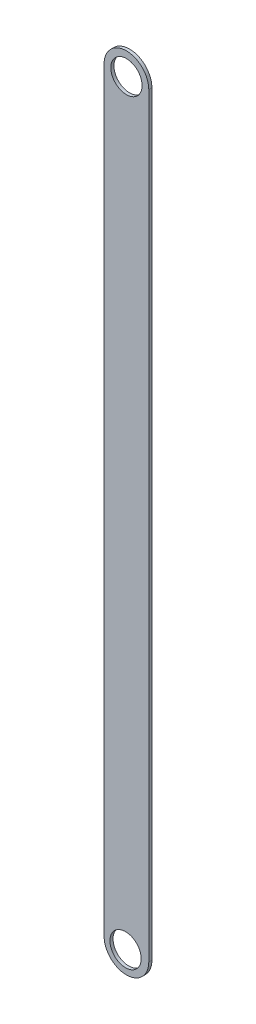
ISO-10303-21;
HEADER;
FILE_DESCRIPTION(('STEP AP214'),'2;1');
FILE_NAME('part.step','',(''),(''),'','','');
FILE_SCHEMA(('AUTOMOTIVE_DESIGN { 1 0 10303 214 1 1 1 1 }'));
ENDSEC;
DATA;
#1=APPLICATION_CONTEXT('core data for automotive mechanical design processes');
#2=APPLICATION_PROTOCOL_DEFINITION('international standard','automotive_design',2000,#1);
#3=PRODUCT_CONTEXT('',#1,'mechanical');
#4=PRODUCT('Part','Part','',(#3));
#5=PRODUCT_RELATED_PRODUCT_CATEGORY('part','',(#4));
#6=PRODUCT_DEFINITION_FORMATION('','',#4);
#7=PRODUCT_DEFINITION_CONTEXT('part definition',#1,'design');
#8=PRODUCT_DEFINITION('design','',#6,#7);
#9=PRODUCT_DEFINITION_SHAPE('','',#8);
#10=(LENGTH_UNIT() NAMED_UNIT(*) SI_UNIT(.MILLI.,.METRE.));
#11=(NAMED_UNIT(*) PLANE_ANGLE_UNIT() SI_UNIT($,.RADIAN.));
#12=(NAMED_UNIT(*) SI_UNIT($,.STERADIAN.) SOLID_ANGLE_UNIT());
#13=UNCERTAINTY_MEASURE_WITH_UNIT(LENGTH_MEASURE(1.E-05),#10,'distance_accuracy_value','');
#14=(GEOMETRIC_REPRESENTATION_CONTEXT(3) GLOBAL_UNCERTAINTY_ASSIGNED_CONTEXT((#13)) GLOBAL_UNIT_ASSIGNED_CONTEXT((#10,
#11,#12)) REPRESENTATION_CONTEXT('',''));
#15=CARTESIAN_POINT('',(0.,0.,0.));
#16=DIRECTION('',(0.,0.,1.));
#17=DIRECTION('',(1.,0.,0.));
#18=AXIS2_PLACEMENT_3D('',#15,#16,#17);
#19=CARTESIAN_POINT('',(89.55,-87.84,-0.045));
#20=DIRECTION('',(0.,0.,-1.));
#21=DIRECTION('',(0.,-1.,0.));
#22=AXIS2_PLACEMENT_3D('',#19,#20,#21);
#23=CYLINDRICAL_SURFACE('',#22,0.175);
#24=CARTESIAN_POINT('',(89.55,-87.84,-0.035));
#25=DIRECTION('',(0.,0.,-1.));
#26=DIRECTION('',(0.,-1.,0.));
#27=AXIS2_PLACEMENT_3D('',#24,#25,#26);
#28=CIRCLE('',#27,0.175);
#29=CARTESIAN_POINT('',(89.55,-88.015,-0.035));
#30=VERTEX_POINT('',#29);
#31=EDGE_CURVE('E139',#30,#30,#28,.T.);
#32=ORIENTED_EDGE('',*,*,#31,.T.);
#33=DIRECTION('',(0.,0.,1.));
#34=VECTOR('',#33,1.);
#35=CARTESIAN_POINT('',(89.55,-88.015,-0.045));
#36=LINE('',#35,#34);
#37=CARTESIAN_POINT('',(89.55,-88.015,0.));
#38=VERTEX_POINT('',#37);
#39=EDGE_CURVE('E11',#30,#38,#36,.T.);
#40=ORIENTED_EDGE('',*,*,#39,.T.);
#41=CARTESIAN_POINT('',(89.55,-87.84,0.));
#42=DIRECTION('',(0.,0.,-1.));
#43=DIRECTION('',(0.,-1.,0.));
#44=AXIS2_PLACEMENT_3D('',#41,#42,#43);
#45=CIRCLE('',#44,0.175);
#46=EDGE_CURVE('E149',#38,#38,#45,.T.);
#47=ORIENTED_EDGE('',*,*,#46,.F.);
#48=ORIENTED_EDGE('',*,*,#39,.F.);
#49=EDGE_LOOP('',(#32,#40,#47,#48));
#50=FACE_BOUND('',#49,.T.);
#51=ADVANCED_FACE('F17',(#50),#23,.F.);
#52=CARTESIAN_POINT('',(89.54,-96.31,-0.045));
#53=DIRECTION('',(0.,0.,-1.));
#54=DIRECTION('',(0.,-1.,0.));
#55=AXIS2_PLACEMENT_3D('',#52,#53,#54);
#56=CYLINDRICAL_SURFACE('',#55,0.175);
#57=CARTESIAN_POINT('',(89.54,-96.31,-0.035));
#58=DIRECTION('',(0.,0.,-1.));
#59=DIRECTION('',(0.,-1.,0.));
#60=AXIS2_PLACEMENT_3D('',#57,#58,#59);
#61=CIRCLE('',#60,0.175);
#62=CARTESIAN_POINT('',(89.54,-96.485,-0.035));
#63=VERTEX_POINT('',#62);
#64=EDGE_CURVE('E135',#63,#63,#61,.T.);
#65=ORIENTED_EDGE('',*,*,#64,.T.);
#66=DIRECTION('',(0.,0.,1.));
#67=VECTOR('',#66,1.);
#68=CARTESIAN_POINT('',(89.54,-96.485,-0.045));
#69=LINE('',#68,#67);
#70=CARTESIAN_POINT('',(89.54,-96.485,0.));
#71=VERTEX_POINT('',#70);
#72=EDGE_CURVE('E26',#63,#71,#69,.T.);
#73=ORIENTED_EDGE('',*,*,#72,.T.);
#74=CARTESIAN_POINT('',(89.54,-96.31,0.));
#75=DIRECTION('',(0.,0.,-1.));
#76=DIRECTION('',(0.,-1.,0.));
#77=AXIS2_PLACEMENT_3D('',#74,#75,#76);
#78=CIRCLE('',#77,0.175);
#79=EDGE_CURVE('E143',#71,#71,#78,.T.);
#80=ORIENTED_EDGE('',*,*,#79,.F.);
#81=ORIENTED_EDGE('',*,*,#72,.F.);
#82=EDGE_LOOP('',(#65,#73,#80,#81));
#83=FACE_BOUND('',#82,.T.);
#84=ADVANCED_FACE('F156',(#83),#56,.F.);
#85=CARTESIAN_POINT('',(89.8,-96.3,-0.035));
#86=DIRECTION('',(-1.,0.,0.));
#87=DIRECTION('',(0.,0.,1.));
#88=AXIS2_PLACEMENT_3D('',#85,#86,#87);
#89=PLANE('',#88);
#90=DIRECTION('',(0.,1.,0.));
#91=VECTOR('',#90,1.);
#92=CARTESIAN_POINT('',(89.8,-96.3,-0.035));
#93=LINE('',#92,#91);
#94=CARTESIAN_POINT('',(89.8,-96.3,-0.035));
#95=VERTEX_POINT('',#94);
#96=CARTESIAN_POINT('',(89.8,-87.84,-0.035));
#97=VERTEX_POINT('',#96);
#98=EDGE_CURVE('E132',#95,#97,#93,.T.);
#99=ORIENTED_EDGE('',*,*,#98,.T.);
#100=DIRECTION('',(0.,0.,1.));
#101=VECTOR('',#100,1.);
#102=CARTESIAN_POINT('',(89.8,-87.84,-0.035));
#103=LINE('',#102,#101);
#104=CARTESIAN_POINT('',(89.8,-87.84,0.));
#105=VERTEX_POINT('',#104);
#106=EDGE_CURVE('E89',#97,#105,#103,.T.);
#107=ORIENTED_EDGE('',*,*,#106,.T.);
#108=DIRECTION('',(0.,1.,0.));
#109=VECTOR('',#108,1.);
#110=CARTESIAN_POINT('',(89.8,-96.3,0.));
#111=LINE('',#110,#109);
#112=CARTESIAN_POINT('',(89.8,-96.3,0.));
#113=VERTEX_POINT('',#112);
#114=EDGE_CURVE('E140',#113,#105,#111,.T.);
#115=ORIENTED_EDGE('',*,*,#114,.F.);
#116=DIRECTION('',(0.,0.,1.));
#117=VECTOR('',#116,1.);
#118=CARTESIAN_POINT('',(89.8,-96.3,-0.035));
#119=LINE('',#118,#117);
#120=EDGE_CURVE('E119',#95,#113,#119,.T.);
#121=ORIENTED_EDGE('',*,*,#120,.F.);
#122=EDGE_LOOP('',(#99,#107,#115,#121));
#123=FACE_BOUND('',#122,.T.);
#124=ADVANCED_FACE('F162',(#123),#89,.F.);
#125=CARTESIAN_POINT('',(89.3,-87.84,0.));
#126=DIRECTION('',(0.,0.,1.));
#127=DIRECTION('',(1.,0.,0.));
#128=AXIS2_PLACEMENT_3D('',#125,#126,#127);
#129=PLANE('',#128);
#130=ORIENTED_EDGE('',*,*,#46,.T.);
#131=EDGE_LOOP('',(#130));
#132=FACE_BOUND('',#131,.T.);
#133=ORIENTED_EDGE('',*,*,#79,.T.);
#134=EDGE_LOOP('',(#133));
#135=FACE_BOUND('',#134,.T.);
#136=DIRECTION('',(0.,-1.,0.));
#137=VECTOR('',#136,1.);
#138=CARTESIAN_POINT('',(89.3,-87.84,0.));
#139=LINE('',#138,#137);
#140=CARTESIAN_POINT('',(89.3,-87.84,0.));
#141=VERTEX_POINT('',#140);
#142=CARTESIAN_POINT('',(89.3,-96.3,0.));
#143=VERTEX_POINT('',#142);
#144=EDGE_CURVE('E101',#141,#143,#139,.T.);
#145=ORIENTED_EDGE('',*,*,#144,.T.);
#146=CARTESIAN_POINT('',(89.55,-96.3,0.));
#147=DIRECTION('',(0.,0.,1.));
#148=DIRECTION('',(-1.,0.,0.));
#149=AXIS2_PLACEMENT_3D('',#146,#147,#148);
#150=CIRCLE('',#149,0.25);
#151=EDGE_CURVE('E128',#143,#113,#150,.T.);
#152=ORIENTED_EDGE('',*,*,#151,.T.);
#153=ORIENTED_EDGE('',*,*,#114,.T.);
#154=CARTESIAN_POINT('',(89.55,-87.84,0.));
#155=DIRECTION('',(0.,0.,1.));
#156=DIRECTION('',(1.,0.,0.));
#157=AXIS2_PLACEMENT_3D('',#154,#155,#156);
#158=CIRCLE('',#157,0.25);
#159=EDGE_CURVE('E93',#105,#141,#158,.T.);
#160=ORIENTED_EDGE('',*,*,#159,.T.);
#161=EDGE_LOOP('',(#145,#152,#153,#160));
#162=FACE_BOUND('',#161,.T.);
#163=ADVANCED_FACE('F159',(#132,#135,#162),#129,.T.);
#164=CARTESIAN_POINT('',(89.3,-87.84,-0.035));
#165=DIRECTION('',(0.,0.,1.));
#166=DIRECTION('',(1.,0.,0.));
#167=AXIS2_PLACEMENT_3D('',#164,#165,#166);
#168=PLANE('',#167);
#169=ORIENTED_EDGE('',*,*,#31,.F.);
#170=EDGE_LOOP('',(#169));
#171=FACE_BOUND('',#170,.T.);
#172=ORIENTED_EDGE('',*,*,#64,.F.);
#173=EDGE_LOOP('',(#172));
#174=FACE_BOUND('',#173,.T.);
#175=CARTESIAN_POINT('',(89.55,-87.84,-0.035));
#176=DIRECTION('',(0.,0.,1.));
#177=DIRECTION('',(1.,0.,0.));
#178=AXIS2_PLACEMENT_3D('',#175,#176,#177);
#179=CIRCLE('',#178,0.25);
#180=CARTESIAN_POINT('',(89.3,-87.84,-0.035));
#181=VERTEX_POINT('',#180);
#182=EDGE_CURVE('E82',#97,#181,#179,.T.);
#183=ORIENTED_EDGE('',*,*,#182,.F.);
#184=ORIENTED_EDGE('',*,*,#98,.F.);
#185=CARTESIAN_POINT('',(89.55,-96.3,-0.035));
#186=DIRECTION('',(0.,0.,1.));
#187=DIRECTION('',(-1.,0.,0.));
#188=AXIS2_PLACEMENT_3D('',#185,#186,#187);
#189=CIRCLE('',#188,0.25);
#190=CARTESIAN_POINT('',(89.3,-96.3,-0.035));
#191=VERTEX_POINT('',#190);
#192=EDGE_CURVE('E106',#191,#95,#189,.T.);
#193=ORIENTED_EDGE('',*,*,#192,.F.);
#194=DIRECTION('',(0.,-1.,0.));
#195=VECTOR('',#194,1.);
#196=CARTESIAN_POINT('',(89.3,-87.84,-0.035));
#197=LINE('',#196,#195);
#198=EDGE_CURVE('E99',#181,#191,#197,.T.);
#199=ORIENTED_EDGE('',*,*,#198,.F.);
#200=EDGE_LOOP('',(#183,#184,#193,#199));
#201=FACE_BOUND('',#200,.T.);
#202=ADVANCED_FACE('F104',(#171,#174,#201),#168,.F.);
#203=CARTESIAN_POINT('',(89.55,-96.3,-0.035));
#204=DIRECTION('',(0.,0.,-1.));
#205=DIRECTION('',(-1.,0.,0.));
#206=AXIS2_PLACEMENT_3D('',#203,#204,#205);
#207=CYLINDRICAL_SURFACE('',#206,0.25);
#208=ORIENTED_EDGE('',*,*,#192,.T.);
#209=ORIENTED_EDGE('',*,*,#120,.T.);
#210=ORIENTED_EDGE('',*,*,#151,.F.);
#211=DIRECTION('',(0.,0.,1.));
#212=VECTOR('',#211,1.);
#213=CARTESIAN_POINT('',(89.3,-96.3,-0.035));
#214=LINE('',#213,#212);
#215=EDGE_CURVE('E109',#191,#143,#214,.T.);
#216=ORIENTED_EDGE('',*,*,#215,.F.);
#217=EDGE_LOOP('',(#208,#209,#210,#216));
#218=FACE_BOUND('',#217,.T.);
#219=ADVANCED_FACE('F167',(#218),#207,.T.);
#220=CARTESIAN_POINT('',(89.55,-87.84,-0.035));
#221=DIRECTION('',(0.,0.,-1.));
#222=DIRECTION('',(1.,0.,0.));
#223=AXIS2_PLACEMENT_3D('',#220,#221,#222);
#224=CYLINDRICAL_SURFACE('',#223,0.25);
#225=ORIENTED_EDGE('',*,*,#182,.T.);
#226=DIRECTION('',(0.,0.,1.));
#227=VECTOR('',#226,1.);
#228=CARTESIAN_POINT('',(89.3,-87.84,-0.035));
#229=LINE('',#228,#227);
#230=EDGE_CURVE('E86',#181,#141,#229,.T.);
#231=ORIENTED_EDGE('',*,*,#230,.T.);
#232=ORIENTED_EDGE('',*,*,#159,.F.);
#233=ORIENTED_EDGE('',*,*,#106,.F.);
#234=EDGE_LOOP('',(#225,#231,#232,#233));
#235=FACE_BOUND('',#234,.T.);
#236=ADVANCED_FACE('F84',(#235),#224,.T.);
#237=CARTESIAN_POINT('',(89.3,-87.84,-0.035));
#238=DIRECTION('',(1.,0.,0.));
#239=DIRECTION('',(0.,1.,0.));
#240=AXIS2_PLACEMENT_3D('',#237,#238,#239);
#241=PLANE('',#240);
#242=ORIENTED_EDGE('',*,*,#198,.T.);
#243=ORIENTED_EDGE('',*,*,#215,.T.);
#244=ORIENTED_EDGE('',*,*,#144,.F.);
#245=ORIENTED_EDGE('',*,*,#230,.F.);
#246=EDGE_LOOP('',(#242,#243,#244,#245));
#247=FACE_BOUND('',#246,.T.);
#248=ADVANCED_FACE('F97',(#247),#241,.F.);
#249=CLOSED_SHELL('',(#51,#84,#124,#163,#202,#219,#236,#248));
#250=MANIFOLD_SOLID_BREP('B1',#249);
#251=ADVANCED_BREP_SHAPE_REPRESENTATION('',(#18,#250),#14);
#252=SHAPE_DEFINITION_REPRESENTATION(#9,#251);
ENDSEC;
END-ISO-10303-21;
